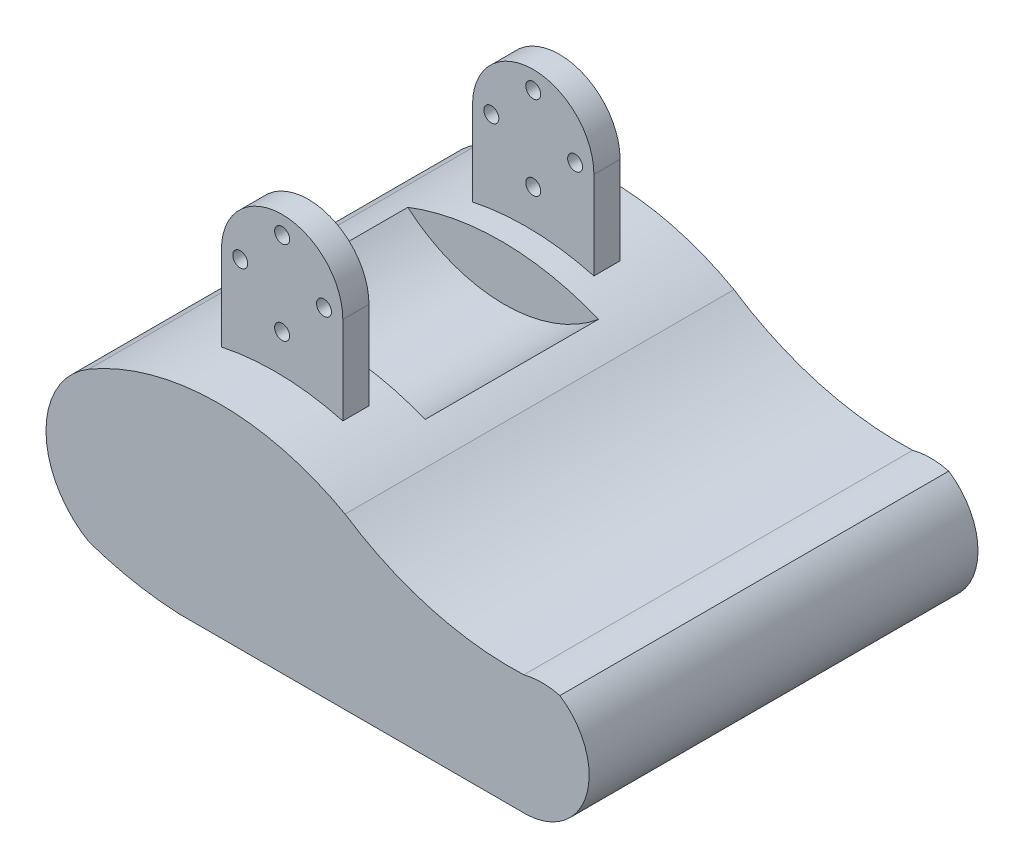
ISO-10303-21;
HEADER;
FILE_DESCRIPTION(('STEP AP214'),'2;1');
FILE_NAME('part.step','',(''),(''),'','','');
FILE_SCHEMA(('AUTOMOTIVE_DESIGN { 1 0 10303 214 1 1 1 1 }'));
ENDSEC;
DATA;
#1=APPLICATION_CONTEXT('core data for automotive mechanical design processes');
#2=APPLICATION_PROTOCOL_DEFINITION('international standard','automotive_design',2000,#1);
#3=PRODUCT_CONTEXT('',#1,'mechanical');
#4=PRODUCT('Part','Part','',(#3));
#5=PRODUCT_RELATED_PRODUCT_CATEGORY('part','',(#4));
#6=PRODUCT_DEFINITION_FORMATION('','',#4);
#7=PRODUCT_DEFINITION_CONTEXT('part definition',#1,'design');
#8=PRODUCT_DEFINITION('design','',#6,#7);
#9=PRODUCT_DEFINITION_SHAPE('','',#8);
#10=(LENGTH_UNIT() NAMED_UNIT(*) SI_UNIT(.MILLI.,.METRE.));
#11=(NAMED_UNIT(*) PLANE_ANGLE_UNIT() SI_UNIT($,.RADIAN.));
#12=(NAMED_UNIT(*) SI_UNIT($,.STERADIAN.) SOLID_ANGLE_UNIT());
#13=UNCERTAINTY_MEASURE_WITH_UNIT(LENGTH_MEASURE(1.E-05),#10,'distance_accuracy_value','');
#14=(GEOMETRIC_REPRESENTATION_CONTEXT(3) GLOBAL_UNCERTAINTY_ASSIGNED_CONTEXT((#13)) GLOBAL_UNIT_ASSIGNED_CONTEXT((#10,
#11,#12)) REPRESENTATION_CONTEXT('',''));
#15=CARTESIAN_POINT('',(0.,0.,0.));
#16=DIRECTION('',(0.,0.,1.));
#17=DIRECTION('',(1.,0.,0.));
#18=AXIS2_PLACEMENT_3D('',#15,#16,#17);
#19=CARTESIAN_POINT('',(-8.19760017163144,-12.2437197366426,40.));
#20=DIRECTION('',(0.,0.,-1.));
#21=DIRECTION('',(-1.,0.,0.));
#22=AXIS2_PLACEMENT_3D('',#19,#20,#21);
#23=CYLINDRICAL_SURFACE('',#22,43.1559879749917);
#24=CARTESIAN_POINT('',(-8.19760017163144,-12.2437197366426,43.175));
#25=DIRECTION('',(0.,0.,1.));
#26=DIRECTION('',(1.,0.,0.));
#27=AXIS2_PLACEMENT_3D('',#24,#25,#26);
#28=CIRCLE('',#27,43.1559879749917);
#29=CARTESIAN_POINT('',(-17.1668419191273,29.9699273525702,43.175));
#30=VERTEX_POINT('',#29);
#31=CARTESIAN_POINT('',(3.12038975833794,29.4017170126909,43.175));
#32=VERTEX_POINT('',#31);
#33=EDGE_CURVE('E379',#30,#32,#28,.F.);
#34=ORIENTED_EDGE('',*,*,#33,.F.);
#35=DIRECTION('',(0.,0.,-1.));
#36=VECTOR('',#35,1.);
#37=CARTESIAN_POINT('',(-17.1668419191273,29.9699273525702,40.));
#38=LINE('',#37,#36);
#39=CARTESIAN_POINT('',(-17.1668419191273,29.9699273525702,38.8));
#40=VERTEX_POINT('',#39);
#41=EDGE_CURVE('E357',#40,#30,#38,.F.);
#42=ORIENTED_EDGE('',*,*,#41,.F.);
#43=CARTESIAN_POINT('',(-8.19760017163144,-12.2437197366426,38.8));
#44=DIRECTION('',(0.,0.,1.));
#45=DIRECTION('',(1.,0.,0.));
#46=AXIS2_PLACEMENT_3D('',#43,#44,#45);
#47=CIRCLE('',#46,43.1559879749917);
#48=CARTESIAN_POINT('',(3.12038975833794,29.4017170126909,38.8));
#49=VERTEX_POINT('',#48);
#50=EDGE_CURVE('E377',#40,#49,#47,.F.);
#51=ORIENTED_EDGE('',*,*,#50,.T.);
#52=DIRECTION('',(0.,0.,-1.));
#53=VECTOR('',#52,1.);
#54=CARTESIAN_POINT('',(3.12038975833794,29.4017170126909,40.));
#55=LINE('',#54,#53);
#56=EDGE_CURVE('E360',#32,#49,#55,.T.);
#57=ORIENTED_EDGE('',*,*,#56,.F.);
#58=EDGE_LOOP('',(#34,#42,#51,#57));
#59=FACE_BOUND('',#58,.T.);
#60=CARTESIAN_POINT('',(-8.19760017163154,-12.2437197366544,5.4));
#61=DIRECTION('',(0.,0.,1.));
#62=DIRECTION('',(-1.,0.,0.));
#63=AXIS2_PLACEMENT_3D('',#60,#61,#62);
#64=CIRCLE('',#63,43.1559879750027);
#65=CARTESIAN_POINT('',(8.09755175302854,27.7176030874316,5.4));
#66=VERTEX_POINT('',#65);
#67=CARTESIAN_POINT('',(-23.7828023131124,27.9997986521216,5.4));
#68=VERTEX_POINT('',#67);
#69=EDGE_CURVE('E321',#66,#68,#64,.T.);
#70=ORIENTED_EDGE('',*,*,#69,.F.);
#71=DIRECTION('',(0.,0.,1.));
#72=VECTOR('',#71,1.);
#73=CARTESIAN_POINT('',(8.09755175302854,27.7176030874316,5.4));
#74=LINE('',#73,#72);
#75=CARTESIAN_POINT('',(8.09755175302854,27.7176030874316,34.4));
#76=VERTEX_POINT('',#75);
#77=EDGE_CURVE('E332',#66,#76,#74,.T.);
#78=ORIENTED_EDGE('',*,*,#77,.T.);
#79=CARTESIAN_POINT('',(-8.19760017163154,-12.2437197366544,34.4));
#80=DIRECTION('',(0.,0.,1.));
#81=DIRECTION('',(-1.,0.,0.));
#82=AXIS2_PLACEMENT_3D('',#79,#80,#81);
#83=CIRCLE('',#82,43.1559879750027);
#84=CARTESIAN_POINT('',(-23.7828023131124,27.9997986521216,34.4));
#85=VERTEX_POINT('',#84);
#86=EDGE_CURVE('E320',#76,#85,#83,.T.);
#87=ORIENTED_EDGE('',*,*,#86,.T.);
#88=DIRECTION('',(0.,0.,1.));
#89=VECTOR('',#88,1.);
#90=CARTESIAN_POINT('',(-23.7828023131124,27.9997986521216,5.4));
#91=LINE('',#90,#89);
#92=EDGE_CURVE('E327',#68,#85,#91,.T.);
#93=ORIENTED_EDGE('',*,*,#92,.F.);
#94=EDGE_LOOP('',(#70,#78,#87,#93));
#95=FACE_BOUND('',#94,.T.);
#96=DIRECTION('',(0.,0.,-1.));
#97=VECTOR('',#96,1.);
#98=CARTESIAN_POINT('',(-30.,25.,40.));
#99=LINE('',#98,#97);
#100=CARTESIAN_POINT('',(-30.,25.,52.5));
#101=VERTEX_POINT('',#100);
#102=CARTESIAN_POINT('',(-30.,25.,-12.5));
#103=VERTEX_POINT('',#102);
#104=EDGE_CURVE('E373',#101,#103,#99,.T.);
#105=ORIENTED_EDGE('',*,*,#104,.F.);
#106=CARTESIAN_POINT('',(-8.19760017163144,-12.2437197366426,52.5));
#107=DIRECTION('',(0.,0.,1.));
#108=DIRECTION('',(1.,0.,0.));
#109=AXIS2_PLACEMENT_3D('',#106,#107,#108);
#110=CIRCLE('',#109,43.1559879749917);
#111=CARTESIAN_POINT('',(12.833158080873,25.441111501169,52.5));
#112=VERTEX_POINT('',#111);
#113=EDGE_CURVE('E275',#112,#101,#110,.T.);
#114=ORIENTED_EDGE('',*,*,#113,.F.);
#115=DIRECTION('',(0.,0.,-1.));
#116=VECTOR('',#115,1.);
#117=CARTESIAN_POINT('',(12.833158080873,25.441111501169,40.));
#118=LINE('',#117,#116);
#119=CARTESIAN_POINT('',(12.833158080873,25.441111501169,-12.5));
#120=VERTEX_POINT('',#119);
#121=EDGE_CURVE('E375',#112,#120,#118,.T.);
#122=ORIENTED_EDGE('',*,*,#121,.T.);
#123=CARTESIAN_POINT('',(-8.19760017163144,-12.2437197366426,-12.5));
#124=DIRECTION('',(0.,0.,1.));
#125=DIRECTION('',(1.,0.,0.));
#126=AXIS2_PLACEMENT_3D('',#123,#124,#125);
#127=CIRCLE('',#126,43.1559879749917);
#128=EDGE_CURVE('E248',#120,#103,#127,.T.);
#129=ORIENTED_EDGE('',*,*,#128,.T.);
#130=EDGE_LOOP('',(#105,#114,#122,#129));
#131=FACE_BOUND('',#130,.T.);
#132=DIRECTION('',(0.,0.,-1.));
#133=VECTOR('',#132,1.);
#134=CARTESIAN_POINT('',(3.12038975833794,29.4017170126909,40.));
#135=LINE('',#134,#133);
#136=CARTESIAN_POINT('',(3.12038975833794,29.4017170126909,-3.175));
#137=VERTEX_POINT('',#136);
#138=CARTESIAN_POINT('',(3.12038975833794,29.4017170126909,1.2));
#139=VERTEX_POINT('',#138);
#140=EDGE_CURVE('E63',#137,#139,#135,.F.);
#141=ORIENTED_EDGE('',*,*,#140,.T.);
#142=CARTESIAN_POINT('',(-8.19760017163144,-12.2437197366426,1.2));
#143=DIRECTION('',(0.,0.,-1.));
#144=DIRECTION('',(-1.,0.,0.));
#145=AXIS2_PLACEMENT_3D('',#142,#143,#144);
#146=CIRCLE('',#145,43.1559879749917);
#147=CARTESIAN_POINT('',(-17.1668419191273,29.9699273525702,1.2));
#148=VERTEX_POINT('',#147);
#149=EDGE_CURVE('E11',#139,#148,#146,.F.);
#150=ORIENTED_EDGE('',*,*,#149,.T.);
#151=DIRECTION('',(0.,0.,-1.));
#152=VECTOR('',#151,1.);
#153=CARTESIAN_POINT('',(-17.1668419191273,29.9699273525702,40.));
#154=LINE('',#153,#152);
#155=CARTESIAN_POINT('',(-17.1668419191273,29.9699273525702,-3.175));
#156=VERTEX_POINT('',#155);
#157=EDGE_CURVE('E53',#148,#156,#154,.T.);
#158=ORIENTED_EDGE('',*,*,#157,.T.);
#159=CARTESIAN_POINT('',(-8.19760017163144,-12.2437197366426,-3.175));
#160=DIRECTION('',(0.,0.,-1.));
#161=DIRECTION('',(-1.,0.,0.));
#162=AXIS2_PLACEMENT_3D('',#159,#160,#161);
#163=CIRCLE('',#162,43.1559879749917);
#164=EDGE_CURVE('E382',#137,#156,#163,.F.);
#165=ORIENTED_EDGE('',*,*,#164,.F.);
#166=EDGE_LOOP('',(#141,#150,#158,#165));
#167=FACE_BOUND('',#166,.T.);
#168=ADVANCED_FACE('F45',(#59,#95,#131,#167),#23,.T.);
#169=CARTESIAN_POINT('',(3.12038975833794,44.0921251761886,38.8));
#170=DIRECTION('',(1.,0.,0.));
#171=DIRECTION('',(0.,1.,0.));
#172=AXIS2_PLACEMENT_3D('',#169,#170,#171);
#173=PLANE('',#172);
#174=DIRECTION('',(0.,1.,0.));
#175=VECTOR('',#174,1.);
#176=CARTESIAN_POINT('',(3.12038975833794,44.0921251761886,43.175));
#177=LINE('',#176,#175);
#178=CARTESIAN_POINT('',(3.12038975833794,44.0921251761886,43.175));
#179=VERTEX_POINT('',#178);
#180=EDGE_CURVE('E343',#32,#179,#177,.T.);
#181=ORIENTED_EDGE('',*,*,#180,.F.);
#182=ORIENTED_EDGE('',*,*,#56,.T.);
#183=DIRECTION('',(0.,1.,0.));
#184=VECTOR('',#183,1.);
#185=CARTESIAN_POINT('',(3.12038975833794,44.0921251761886,38.8));
#186=LINE('',#185,#184);
#187=CARTESIAN_POINT('',(3.12038975833794,44.0921251761886,38.8));
#188=VERTEX_POINT('',#187);
#189=EDGE_CURVE('E351',#49,#188,#186,.T.);
#190=ORIENTED_EDGE('',*,*,#189,.T.);
#191=DIRECTION('',(0.,0.,1.));
#192=VECTOR('',#191,1.);
#193=CARTESIAN_POINT('',(3.12038975833794,44.0921251761886,38.8));
#194=LINE('',#193,#192);
#195=EDGE_CURVE('E354',#188,#179,#194,.T.);
#196=ORIENTED_EDGE('',*,*,#195,.T.);
#197=EDGE_LOOP('',(#181,#182,#190,#196));
#198=FACE_BOUND('',#197,.T.);
#199=ADVANCED_FACE('F403',(#198),#173,.T.);
#200=CARTESIAN_POINT('',(-17.1668419191273,44.0921251761886,38.8));
#201=DIRECTION('',(-1.,0.,0.));
#202=DIRECTION('',(0.,-1.,0.));
#203=AXIS2_PLACEMENT_3D('',#200,#201,#202);
#204=PLANE('',#203);
#205=ORIENTED_EDGE('',*,*,#41,.T.);
#206=DIRECTION('',(0.,-1.,0.));
#207=VECTOR('',#206,1.);
#208=CARTESIAN_POINT('',(-17.1668419191273,44.0921251761886,43.175));
#209=LINE('',#208,#207);
#210=CARTESIAN_POINT('',(-17.1668419191273,44.0921251761886,43.175));
#211=VERTEX_POINT('',#210);
#212=EDGE_CURVE('E340',#211,#30,#209,.T.);
#213=ORIENTED_EDGE('',*,*,#212,.F.);
#214=DIRECTION('',(0.,0.,1.));
#215=VECTOR('',#214,1.);
#216=CARTESIAN_POINT('',(-17.1668419191273,44.0921251761886,38.8));
#217=LINE('',#216,#215);
#218=CARTESIAN_POINT('',(-17.1668419191273,44.0921251761886,38.8));
#219=VERTEX_POINT('',#218);
#220=EDGE_CURVE('E353',#219,#211,#217,.T.);
#221=ORIENTED_EDGE('',*,*,#220,.F.);
#222=DIRECTION('',(0.,-1.,0.));
#223=VECTOR('',#222,1.);
#224=CARTESIAN_POINT('',(-17.1668419191273,44.0921251761886,38.8));
#225=LINE('',#224,#223);
#226=EDGE_CURVE('E348',#219,#40,#225,.T.);
#227=ORIENTED_EDGE('',*,*,#226,.T.);
#228=EDGE_LOOP('',(#205,#213,#221,#227));
#229=FACE_BOUND('',#228,.T.);
#230=ADVANCED_FACE('F410',(#229),#204,.T.);
#231=CARTESIAN_POINT('',(40.6285609928474,67.4056096459166,40.));
#232=DIRECTION('',(0.,0.,-1.));
#233=DIRECTION('',(-1.,0.,0.));
#234=AXIS2_PLACEMENT_3D('',#231,#232,#233);
#235=CYLINDRICAL_SURFACE('',#234,50.3349136045698);
#236=DIRECTION('',(0.,0.,-1.));
#237=VECTOR('',#236,1.);
#238=CARTESIAN_POINT('',(42.708069615881,17.1136702175527,40.));
#239=LINE('',#238,#237);
#240=CARTESIAN_POINT('',(42.708069615881,17.1136702175526,52.5));
#241=VERTEX_POINT('',#240);
#242=CARTESIAN_POINT('',(42.708069615881,17.1136702175526,-12.5));
#243=VERTEX_POINT('',#242);
#244=EDGE_CURVE('E363',#241,#243,#239,.T.);
#245=ORIENTED_EDGE('',*,*,#244,.T.);
#246=CARTESIAN_POINT('',(40.6285609928474,67.4056096459166,-12.5));
#247=DIRECTION('',(0.,0.,1.));
#248=DIRECTION('',(1.,0.,0.));
#249=AXIS2_PLACEMENT_3D('',#246,#247,#248);
#250=CIRCLE('',#249,50.3349136045698);
#251=EDGE_CURVE('E257',#243,#120,#250,.F.);
#252=ORIENTED_EDGE('',*,*,#251,.T.);
#253=ORIENTED_EDGE('',*,*,#121,.F.);
#254=CARTESIAN_POINT('',(40.6285609928474,67.4056096459166,52.5));
#255=DIRECTION('',(0.,0.,1.));
#256=DIRECTION('',(1.,0.,0.));
#257=AXIS2_PLACEMENT_3D('',#254,#255,#256);
#258=CIRCLE('',#257,50.3349136045698);
#259=EDGE_CURVE('E293',#241,#112,#258,.F.);
#260=ORIENTED_EDGE('',*,*,#259,.F.);
#261=EDGE_LOOP('',(#245,#252,#253,#260));
#262=FACE_BOUND('',#261,.T.);
#263=ADVANCED_FACE('F47',(#262),#235,.F.);
#264=CARTESIAN_POINT('',(-22.6825247375472,12.5,40.));
#265=DIRECTION('',(0.,0.,-1.));
#266=DIRECTION('',(-1.,0.,0.));
#267=AXIS2_PLACEMENT_3D('',#264,#265,#266);
#268=CYLINDRICAL_SURFACE('',#267,14.4843171815798);
#269=ORIENTED_EDGE('',*,*,#104,.T.);
#270=CARTESIAN_POINT('',(-22.6825247375472,12.5,-12.5));
#271=DIRECTION('',(0.,0.,1.));
#272=DIRECTION('',(1.,0.,0.));
#273=AXIS2_PLACEMENT_3D('',#270,#271,#272);
#274=CIRCLE('',#273,14.4843171815798);
#275=CARTESIAN_POINT('',(-30.,0.,-12.5));
#276=VERTEX_POINT('',#275);
#277=EDGE_CURVE('E272',#103,#276,#274,.T.);
#278=ORIENTED_EDGE('',*,*,#277,.T.);
#279=DIRECTION('',(0.,0.,-1.));
#280=VECTOR('',#279,1.);
#281=CARTESIAN_POINT('',(-30.,0.,40.));
#282=LINE('',#281,#280);
#283=CARTESIAN_POINT('',(-30.,0.,52.5));
#284=VERTEX_POINT('',#283);
#285=EDGE_CURVE('E371',#284,#276,#282,.T.);
#286=ORIENTED_EDGE('',*,*,#285,.F.);
#287=CARTESIAN_POINT('',(-22.6825247375472,12.5,52.5));
#288=DIRECTION('',(0.,0.,1.));
#289=DIRECTION('',(1.,0.,0.));
#290=AXIS2_PLACEMENT_3D('',#287,#288,#289);
#291=CIRCLE('',#290,14.4843171815798);
#292=EDGE_CURVE('E278',#101,#284,#291,.T.);
#293=ORIENTED_EDGE('',*,*,#292,.F.);
#294=EDGE_LOOP('',(#269,#278,#286,#293));
#295=FACE_BOUND('',#294,.T.);
#296=ADVANCED_FACE('F416',(#295),#268,.T.);
#297=CARTESIAN_POINT('',(-12.2066730687182,52.0503426449492,40.));
#298=DIRECTION('',(0.,0.,-1.));
#299=DIRECTION('',(-1.,0.,0.));
#300=AXIS2_PLACEMENT_3D('',#297,#298,#299);
#301=CYLINDRICAL_SURFACE('',#300,55.0076417667591);
#302=ORIENTED_EDGE('',*,*,#285,.T.);
#303=CARTESIAN_POINT('',(-12.2066730687182,52.0503426449492,-12.5));
#304=DIRECTION('',(0.,0.,1.));
#305=DIRECTION('',(1.,0.,0.));
#306=AXIS2_PLACEMENT_3D('',#303,#304,#305);
#307=CIRCLE('',#306,55.0076417667591);
#308=CARTESIAN_POINT('',(-15.,-2.88632978244734,-12.5));
#309=VERTEX_POINT('',#308);
#310=EDGE_CURVE('E269',#276,#309,#307,.T.);
#311=ORIENTED_EDGE('',*,*,#310,.T.);
#312=DIRECTION('',(0.,0.,-1.));
#313=VECTOR('',#312,1.);
#314=CARTESIAN_POINT('',(-15.,-2.88632978244734,40.));
#315=LINE('',#314,#313);
#316=CARTESIAN_POINT('',(-15.,-2.88632978244734,52.5));
#317=VERTEX_POINT('',#316);
#318=EDGE_CURVE('E369',#317,#309,#315,.T.);
#319=ORIENTED_EDGE('',*,*,#318,.F.);
#320=CARTESIAN_POINT('',(-12.2066730687182,52.0503426449492,52.5));
#321=DIRECTION('',(0.,0.,1.));
#322=DIRECTION('',(1.,0.,0.));
#323=AXIS2_PLACEMENT_3D('',#320,#321,#322);
#324=CIRCLE('',#323,55.0076417667591);
#325=EDGE_CURVE('E281',#284,#317,#324,.T.);
#326=ORIENTED_EDGE('',*,*,#325,.F.);
#327=EDGE_LOOP('',(#302,#311,#319,#326));
#328=FACE_BOUND('',#327,.T.);
#329=ADVANCED_FACE('F419',(#328),#301,.T.);
#330=CARTESIAN_POINT('',(0.,-2.88632978244734,40.));
#331=DIRECTION('',(0.,1.,0.));
#332=DIRECTION('',(0.,0.,1.));
#333=AXIS2_PLACEMENT_3D('',#330,#331,#332);
#334=PLANE('',#333);
#335=DIRECTION('',(1.,0.,0.));
#336=VECTOR('',#335,1.);
#337=CARTESIAN_POINT('',(-12.,-2.88632978244734,-9.5));
#338=LINE('',#337,#336);
#339=CARTESIAN_POINT('',(-12.,-2.88632978244734,-9.5));
#340=VERTEX_POINT('',#339);
#341=CARTESIAN_POINT('',(39.025429481435,-2.88632978244734,-9.5));
#342=VERTEX_POINT('',#341);
#343=EDGE_CURVE('E238',#340,#342,#338,.T.);
#344=ORIENTED_EDGE('',*,*,#343,.F.);
#345=DIRECTION('',(0.,0.,-1.));
#346=VECTOR('',#345,1.);
#347=CARTESIAN_POINT('',(-12.,-2.88632978244734,49.5));
#348=LINE('',#347,#346);
#349=CARTESIAN_POINT('',(-12.,-2.88632978244734,49.5));
#350=VERTEX_POINT('',#349);
#351=EDGE_CURVE('E221',#350,#340,#348,.T.);
#352=ORIENTED_EDGE('',*,*,#351,.F.);
#353=DIRECTION('',(-1.,0.,0.));
#354=VECTOR('',#353,1.);
#355=CARTESIAN_POINT('',(39.025429481435,-2.88632978244734,49.5));
#356=LINE('',#355,#354);
#357=CARTESIAN_POINT('',(39.025429481435,-2.88632978244734,49.5));
#358=VERTEX_POINT('',#357);
#359=EDGE_CURVE('E227',#358,#350,#356,.T.);
#360=ORIENTED_EDGE('',*,*,#359,.F.);
#361=DIRECTION('',(0.,0.,1.));
#362=VECTOR('',#361,1.);
#363=CARTESIAN_POINT('',(39.025429481435,-2.88632978244734,-9.5));
#364=LINE('',#363,#362);
#365=EDGE_CURVE('E241',#342,#358,#364,.T.);
#366=ORIENTED_EDGE('',*,*,#365,.F.);
#367=EDGE_LOOP('',(#344,#352,#360,#366));
#368=FACE_BOUND('',#367,.T.);
#369=ORIENTED_EDGE('',*,*,#318,.T.);
#370=DIRECTION('',(1.,0.,0.));
#371=VECTOR('',#370,1.);
#372=CARTESIAN_POINT('',(0.,-2.88632978244734,-12.5));
#373=LINE('',#372,#371);
#374=CARTESIAN_POINT('',(42.025429481435,-2.88632978244734,-12.5));
#375=VERTEX_POINT('',#374);
#376=EDGE_CURVE('E266',#309,#375,#373,.T.);
#377=ORIENTED_EDGE('',*,*,#376,.T.);
#378=DIRECTION('',(0.,0.,-1.));
#379=VECTOR('',#378,1.);
#380=CARTESIAN_POINT('',(42.025429481435,-2.88632978244734,40.));
#381=LINE('',#380,#379);
#382=CARTESIAN_POINT('',(42.025429481435,-2.88632978244734,52.5));
#383=VERTEX_POINT('',#382);
#384=EDGE_CURVE('E367',#383,#375,#381,.T.);
#385=ORIENTED_EDGE('',*,*,#384,.F.);
#386=DIRECTION('',(1.,0.,0.));
#387=VECTOR('',#386,1.);
#388=CARTESIAN_POINT('',(0.,-2.88632978244734,52.5));
#389=LINE('',#388,#387);
#390=EDGE_CURVE('E284',#317,#383,#389,.T.);
#391=ORIENTED_EDGE('',*,*,#390,.F.);
#392=EDGE_LOOP('',(#369,#377,#385,#391));
#393=FACE_BOUND('',#392,.T.);
#394=ADVANCED_FACE('F423',(#368,#393),#334,.F.);
#395=CARTESIAN_POINT('',(42.7080696158892,8.00980736960607,40.));
#396=DIRECTION('',(0.,0.,-1.));
#397=DIRECTION('',(-1.,0.,0.));
#398=AXIS2_PLACEMENT_3D('',#395,#396,#397);
#399=CYLINDRICAL_SURFACE('',#398,10.9174998231979);
#400=ORIENTED_EDGE('',*,*,#384,.T.);
#401=CARTESIAN_POINT('',(42.7080696158892,8.00980736960607,-12.5));
#402=DIRECTION('',(0.,0.,1.));
#403=DIRECTION('',(1.,0.,0.));
#404=AXIS2_PLACEMENT_3D('',#401,#402,#403);
#405=CIRCLE('',#404,10.9174998231979);
#406=CARTESIAN_POINT('',(48.7339706800707,17.1136702175527,-12.5));
#407=VERTEX_POINT('',#406);
#408=EDGE_CURVE('E263',#375,#407,#405,.T.);
#409=ORIENTED_EDGE('',*,*,#408,.T.);
#410=DIRECTION('',(0.,0.,-1.));
#411=VECTOR('',#410,1.);
#412=CARTESIAN_POINT('',(48.7339706800707,17.1136702175527,40.));
#413=LINE('',#412,#411);
#414=CARTESIAN_POINT('',(48.7339706800707,17.1136702175527,52.5));
#415=VERTEX_POINT('',#414);
#416=EDGE_CURVE('E365',#415,#407,#413,.T.);
#417=ORIENTED_EDGE('',*,*,#416,.F.);
#418=CARTESIAN_POINT('',(42.7080696158892,8.00980736960607,52.5));
#419=DIRECTION('',(0.,0.,1.));
#420=DIRECTION('',(1.,0.,0.));
#421=AXIS2_PLACEMENT_3D('',#418,#419,#420);
#422=CIRCLE('',#421,10.9174998231979);
#423=EDGE_CURVE('E287',#383,#415,#422,.T.);
#424=ORIENTED_EDGE('',*,*,#423,.F.);
#425=EDGE_LOOP('',(#400,#409,#417,#424));
#426=FACE_BOUND('',#425,.T.);
#427=ADVANCED_FACE('F427',(#426),#399,.T.);
#428=CARTESIAN_POINT('',(45.7210201479759,5.46479243697213,40.));
#429=DIRECTION('',(0.,0.,-1.));
#430=DIRECTION('',(-1.,0.,0.));
#431=AXIS2_PLACEMENT_3D('',#428,#429,#430);
#432=CYLINDRICAL_SURFACE('',#431,12.032216107424);
#433=ORIENTED_EDGE('',*,*,#416,.T.);
#434=CARTESIAN_POINT('',(45.7210201479759,5.46479243697213,-12.5));
#435=DIRECTION('',(0.,0.,1.));
#436=DIRECTION('',(1.,0.,0.));
#437=AXIS2_PLACEMENT_3D('',#434,#435,#436);
#438=CIRCLE('',#437,12.032216107424);
#439=EDGE_CURVE('E260',#407,#243,#438,.T.);
#440=ORIENTED_EDGE('',*,*,#439,.T.);
#441=ORIENTED_EDGE('',*,*,#244,.F.);
#442=CARTESIAN_POINT('',(45.7210201479759,5.46479243697213,52.5));
#443=DIRECTION('',(0.,0.,1.));
#444=DIRECTION('',(1.,0.,0.));
#445=AXIS2_PLACEMENT_3D('',#442,#443,#444);
#446=CIRCLE('',#445,12.032216107424);
#447=EDGE_CURVE('E290',#415,#241,#446,.T.);
#448=ORIENTED_EDGE('',*,*,#447,.F.);
#449=EDGE_LOOP('',(#433,#440,#441,#448));
#450=FACE_BOUND('',#449,.T.);
#451=ADVANCED_FACE('F431',(#450),#432,.T.);
#452=CARTESIAN_POINT('',(-7.02322608039468,44.0921251761886,38.8));
#453=DIRECTION('',(0.,0.,1.));
#454=DIRECTION('',(1.,0.,0.));
#455=AXIS2_PLACEMENT_3D('',#452,#453,#454);
#456=CYLINDRICAL_SURFACE('',#455,10.1436158387326);
#457=ORIENTED_EDGE('',*,*,#220,.T.);
#458=CARTESIAN_POINT('',(-7.02322608039468,44.0921251761886,43.175));
#459=DIRECTION('',(0.,0.,1.));
#460=DIRECTION('',(1.,0.,0.));
#461=AXIS2_PLACEMENT_3D('',#458,#459,#460);
#462=CIRCLE('',#461,10.1436158387326);
#463=EDGE_CURVE('E335',#179,#211,#462,.T.);
#464=ORIENTED_EDGE('',*,*,#463,.F.);
#465=ORIENTED_EDGE('',*,*,#195,.F.);
#466=CARTESIAN_POINT('',(-7.02322608039468,44.0921251761886,38.8));
#467=DIRECTION('',(0.,0.,1.));
#468=DIRECTION('',(1.,0.,0.));
#469=AXIS2_PLACEMENT_3D('',#466,#467,#468);
#470=CIRCLE('',#469,10.1436158387326);
#471=EDGE_CURVE('E345',#188,#219,#470,.T.);
#472=ORIENTED_EDGE('',*,*,#471,.T.);
#473=EDGE_LOOP('',(#457,#464,#465,#472));
#474=FACE_BOUND('',#473,.T.);
#475=ADVANCED_FACE('F435',(#474),#456,.T.);
#476=CARTESIAN_POINT('',(-7.02322608039468,44.0921251761886,38.8));
#477=DIRECTION('',(0.,0.,1.));
#478=DIRECTION('',(1.,0.,0.));
#479=AXIS2_PLACEMENT_3D('',#476,#477,#478);
#480=PLANE('',#479);
#481=CARTESIAN_POINT('',(-7.02322608039468,51.2357410149212,38.8));
#482=DIRECTION('',(0.,0.,1.));
#483=DIRECTION('',(1.,0.,0.));
#484=AXIS2_PLACEMENT_3D('',#481,#482,#483);
#485=CIRCLE('',#484,1.25);
#486=CARTESIAN_POINT('',(-5.77322608039468,51.2357410149212,38.8));
#487=VERTEX_POINT('',#486);
#488=EDGE_CURVE('E317',#487,#487,#485,.T.);
#489=ORIENTED_EDGE('',*,*,#488,.T.);
#490=EDGE_LOOP('',(#489));
#491=FACE_BOUND('',#490,.T.);
#492=CARTESIAN_POINT('',(-0.0232260803946782,44.2357410149212,38.8));
#493=DIRECTION('',(0.,0.,1.));
#494=DIRECTION('',(1.,0.,0.));
#495=AXIS2_PLACEMENT_3D('',#492,#493,#494);
#496=CIRCLE('',#495,1.25);
#497=CARTESIAN_POINT('',(1.22677391960532,44.2357410149212,38.8));
#498=VERTEX_POINT('',#497);
#499=EDGE_CURVE('E314',#498,#498,#496,.T.);
#500=ORIENTED_EDGE('',*,*,#499,.T.);
#501=EDGE_LOOP('',(#500));
#502=FACE_BOUND('',#501,.T.);
#503=CARTESIAN_POINT('',(-7.02322608039468,37.2357410149212,38.8));
#504=DIRECTION('',(0.,0.,1.));
#505=DIRECTION('',(1.,0.,0.));
#506=AXIS2_PLACEMENT_3D('',#503,#504,#505);
#507=CIRCLE('',#506,1.25);
#508=CARTESIAN_POINT('',(-5.77322608039468,37.2357410149212,38.8));
#509=VERTEX_POINT('',#508);
#510=EDGE_CURVE('E311',#509,#509,#507,.T.);
#511=ORIENTED_EDGE('',*,*,#510,.T.);
#512=EDGE_LOOP('',(#511));
#513=FACE_BOUND('',#512,.T.);
#514=CARTESIAN_POINT('',(-14.0232260803947,44.2357410149212,38.8));
#515=DIRECTION('',(0.,0.,1.));
#516=DIRECTION('',(1.,0.,0.));
#517=AXIS2_PLACEMENT_3D('',#514,#515,#516);
#518=CIRCLE('',#517,1.25);
#519=CARTESIAN_POINT('',(-12.7732260803947,44.2357410149212,38.8));
#520=VERTEX_POINT('',#519);
#521=EDGE_CURVE('E300',#520,#520,#518,.T.);
#522=ORIENTED_EDGE('',*,*,#521,.T.);
#523=EDGE_LOOP('',(#522));
#524=FACE_BOUND('',#523,.T.);
#525=ORIENTED_EDGE('',*,*,#50,.F.);
#526=ORIENTED_EDGE('',*,*,#226,.F.);
#527=ORIENTED_EDGE('',*,*,#471,.F.);
#528=ORIENTED_EDGE('',*,*,#189,.F.);
#529=EDGE_LOOP('',(#525,#526,#527,#528));
#530=FACE_BOUND('',#529,.T.);
#531=ADVANCED_FACE('F439',(#491,#502,#513,#524,#530),#480,.F.);
#532=CARTESIAN_POINT('',(-7.02322608039468,44.0921251761886,43.175));
#533=DIRECTION('',(0.,0.,1.));
#534=DIRECTION('',(1.,0.,0.));
#535=AXIS2_PLACEMENT_3D('',#532,#533,#534);
#536=PLANE('',#535);
#537=CARTESIAN_POINT('',(-7.02322608039468,51.2357410149212,43.175));
#538=DIRECTION('',(0.,0.,1.));
#539=DIRECTION('',(1.,0.,0.));
#540=AXIS2_PLACEMENT_3D('',#537,#538,#539);
#541=CIRCLE('',#540,1.25);
#542=CARTESIAN_POINT('',(-5.77322608039468,51.2357410149212,43.175));
#543=VERTEX_POINT('',#542);
#544=EDGE_CURVE('E297',#543,#543,#541,.T.);
#545=ORIENTED_EDGE('',*,*,#544,.F.);
#546=EDGE_LOOP('',(#545));
#547=FACE_BOUND('',#546,.T.);
#548=CARTESIAN_POINT('',(-0.0232260803946782,44.2357410149212,43.175));
#549=DIRECTION('',(0.,0.,1.));
#550=DIRECTION('',(1.,0.,0.));
#551=AXIS2_PLACEMENT_3D('',#548,#549,#550);
#552=CIRCLE('',#551,1.25);
#553=CARTESIAN_POINT('',(1.22677391960532,44.2357410149212,43.175));
#554=VERTEX_POINT('',#553);
#555=EDGE_CURVE('E301',#554,#554,#552,.T.);
#556=ORIENTED_EDGE('',*,*,#555,.F.);
#557=EDGE_LOOP('',(#556));
#558=FACE_BOUND('',#557,.T.);
#559=CARTESIAN_POINT('',(-7.02322608039468,37.2357410149212,43.175));
#560=DIRECTION('',(0.,0.,1.));
#561=DIRECTION('',(1.,0.,0.));
#562=AXIS2_PLACEMENT_3D('',#559,#560,#561);
#563=CIRCLE('',#562,1.25);
#564=CARTESIAN_POINT('',(-5.77322608039468,37.2357410149212,43.175));
#565=VERTEX_POINT('',#564);
#566=EDGE_CURVE('E304',#565,#565,#563,.T.);
#567=ORIENTED_EDGE('',*,*,#566,.F.);
#568=EDGE_LOOP('',(#567));
#569=FACE_BOUND('',#568,.T.);
#570=CARTESIAN_POINT('',(-14.0232260803947,44.2357410149212,43.175));
#571=DIRECTION('',(0.,0.,1.));
#572=DIRECTION('',(1.,0.,0.));
#573=AXIS2_PLACEMENT_3D('',#570,#571,#572);
#574=CIRCLE('',#573,1.25);
#575=CARTESIAN_POINT('',(-12.7732260803947,44.2357410149212,43.175));
#576=VERTEX_POINT('',#575);
#577=EDGE_CURVE('E296',#576,#576,#574,.T.);
#578=ORIENTED_EDGE('',*,*,#577,.F.);
#579=EDGE_LOOP('',(#578));
#580=FACE_BOUND('',#579,.T.);
#581=ORIENTED_EDGE('',*,*,#212,.T.);
#582=ORIENTED_EDGE('',*,*,#33,.T.);
#583=ORIENTED_EDGE('',*,*,#180,.T.);
#584=ORIENTED_EDGE('',*,*,#463,.T.);
#585=EDGE_LOOP('',(#581,#582,#583,#584));
#586=FACE_BOUND('',#585,.T.);
#587=ADVANCED_FACE('F446',(#547,#558,#569,#580,#586),#536,.T.);
#588=CARTESIAN_POINT('',(-7.6768083390229,46.5914644256421,5.4));
#589=DIRECTION('',(0.,0.,1.));
#590=DIRECTION('',(1.,0.,0.));
#591=AXIS2_PLACEMENT_3D('',#588,#589,#590);
#592=CYLINDRICAL_SURFACE('',#591,24.5978266952123);
#593=CARTESIAN_POINT('',(-7.6768083390229,46.5914644256421,34.4));
#594=DIRECTION('',(0.,0.,1.));
#595=DIRECTION('',(1.,0.,0.));
#596=AXIS2_PLACEMENT_3D('',#593,#594,#595);
#597=CIRCLE('',#596,24.5978266952123);
#598=EDGE_CURVE('E324',#85,#76,#597,.T.);
#599=ORIENTED_EDGE('',*,*,#598,.T.);
#600=ORIENTED_EDGE('',*,*,#77,.F.);
#601=CARTESIAN_POINT('',(-7.6768083390229,46.5914644256421,5.4));
#602=DIRECTION('',(0.,0.,1.));
#603=DIRECTION('',(1.,0.,0.));
#604=AXIS2_PLACEMENT_3D('',#601,#602,#603);
#605=CIRCLE('',#604,24.5978266952123);
#606=EDGE_CURVE('E323',#68,#66,#605,.T.);
#607=ORIENTED_EDGE('',*,*,#606,.F.);
#608=ORIENTED_EDGE('',*,*,#92,.T.);
#609=EDGE_LOOP('',(#599,#600,#607,#608));
#610=FACE_BOUND('',#609,.T.);
#611=ADVANCED_FACE('F450',(#610),#592,.F.);
#612=CARTESIAN_POINT('',(-7.93720425532722,17.1738723444938,5.4));
#613=DIRECTION('',(0.,0.,-1.));
#614=DIRECTION('',(-1.,0.,0.));
#615=AXIS2_PLACEMENT_3D('',#612,#613,#614);
#616=PLANE('',#615);
#617=ORIENTED_EDGE('',*,*,#69,.T.);
#618=ORIENTED_EDGE('',*,*,#606,.T.);
#619=EDGE_LOOP('',(#617,#618));
#620=FACE_BOUND('',#619,.T.);
#621=ADVANCED_FACE('F454',(#620),#616,.F.);
#622=CARTESIAN_POINT('',(-7.93720425532722,17.1738723444938,34.4));
#623=DIRECTION('',(0.,0.,-1.));
#624=DIRECTION('',(-1.,0.,0.));
#625=AXIS2_PLACEMENT_3D('',#622,#623,#624);
#626=PLANE('',#625);
#627=ORIENTED_EDGE('',*,*,#86,.F.);
#628=ORIENTED_EDGE('',*,*,#598,.F.);
#629=EDGE_LOOP('',(#627,#628));
#630=FACE_BOUND('',#629,.T.);
#631=ADVANCED_FACE('F456',(#630),#626,.T.);
#632=CARTESIAN_POINT('',(-14.0232260803947,44.2357410149212,33.175));
#633=DIRECTION('',(0.,0.,1.));
#634=DIRECTION('',(1.,0.,0.));
#635=AXIS2_PLACEMENT_3D('',#632,#633,#634);
#636=CYLINDRICAL_SURFACE('',#635,1.25);
#637=ORIENTED_EDGE('',*,*,#577,.T.);
#638=EDGE_LOOP('',(#637));
#639=FACE_BOUND('',#638,.T.);
#640=ORIENTED_EDGE('',*,*,#521,.F.);
#641=EDGE_LOOP('',(#640));
#642=FACE_BOUND('',#641,.T.);
#643=ADVANCED_FACE('F459',(#639,#642),#636,.F.);
#644=CARTESIAN_POINT('',(-7.02322608039468,37.2357410149212,33.175));
#645=DIRECTION('',(0.,0.,1.));
#646=DIRECTION('',(1.,0.,0.));
#647=AXIS2_PLACEMENT_3D('',#644,#645,#646);
#648=CYLINDRICAL_SURFACE('',#647,1.25);
#649=ORIENTED_EDGE('',*,*,#566,.T.);
#650=EDGE_LOOP('',(#649));
#651=FACE_BOUND('',#650,.T.);
#652=ORIENTED_EDGE('',*,*,#510,.F.);
#653=EDGE_LOOP('',(#652));
#654=FACE_BOUND('',#653,.T.);
#655=ADVANCED_FACE('F466',(#651,#654),#648,.F.);
#656=CARTESIAN_POINT('',(-0.0232260803946782,44.2357410149212,33.175));
#657=DIRECTION('',(0.,0.,1.));
#658=DIRECTION('',(1.,0.,0.));
#659=AXIS2_PLACEMENT_3D('',#656,#657,#658);
#660=CYLINDRICAL_SURFACE('',#659,1.25);
#661=ORIENTED_EDGE('',*,*,#555,.T.);
#662=EDGE_LOOP('',(#661));
#663=FACE_BOUND('',#662,.T.);
#664=ORIENTED_EDGE('',*,*,#499,.F.);
#665=EDGE_LOOP('',(#664));
#666=FACE_BOUND('',#665,.T.);
#667=ADVANCED_FACE('F470',(#663,#666),#660,.F.);
#668=CARTESIAN_POINT('',(-7.02322608039468,51.2357410149212,33.175));
#669=DIRECTION('',(0.,0.,1.));
#670=DIRECTION('',(1.,0.,0.));
#671=AXIS2_PLACEMENT_3D('',#668,#669,#670);
#672=CYLINDRICAL_SURFACE('',#671,1.25);
#673=ORIENTED_EDGE('',*,*,#544,.T.);
#674=EDGE_LOOP('',(#673));
#675=FACE_BOUND('',#674,.T.);
#676=ORIENTED_EDGE('',*,*,#488,.F.);
#677=EDGE_LOOP('',(#676));
#678=FACE_BOUND('',#677,.T.);
#679=ADVANCED_FACE('F474',(#675,#678),#672,.F.);
#680=CARTESIAN_POINT('',(0.,0.,52.5));
#681=DIRECTION('',(0.,0.,1.));
#682=DIRECTION('',(1.,0.,0.));
#683=AXIS2_PLACEMENT_3D('',#680,#681,#682);
#684=PLANE('',#683);
#685=ORIENTED_EDGE('',*,*,#113,.T.);
#686=ORIENTED_EDGE('',*,*,#292,.T.);
#687=ORIENTED_EDGE('',*,*,#325,.T.);
#688=ORIENTED_EDGE('',*,*,#390,.T.);
#689=ORIENTED_EDGE('',*,*,#423,.T.);
#690=ORIENTED_EDGE('',*,*,#447,.T.);
#691=ORIENTED_EDGE('',*,*,#259,.T.);
#692=EDGE_LOOP('',(#685,#686,#687,#688,#689,#690,#691));
#693=FACE_BOUND('',#692,.T.);
#694=ADVANCED_FACE('F478',(#693),#684,.T.);
#695=CARTESIAN_POINT('',(0.,0.,-12.5));
#696=DIRECTION('',(0.,0.,-1.));
#697=DIRECTION('',(1.,0.,0.));
#698=AXIS2_PLACEMENT_3D('',#695,#696,#697);
#699=PLANE('',#698);
#700=ORIENTED_EDGE('',*,*,#128,.F.);
#701=ORIENTED_EDGE('',*,*,#251,.F.);
#702=ORIENTED_EDGE('',*,*,#439,.F.);
#703=ORIENTED_EDGE('',*,*,#408,.F.);
#704=ORIENTED_EDGE('',*,*,#376,.F.);
#705=ORIENTED_EDGE('',*,*,#310,.F.);
#706=ORIENTED_EDGE('',*,*,#277,.F.);
#707=EDGE_LOOP('',(#700,#701,#702,#703,#704,#705,#706));
#708=FACE_BOUND('',#707,.T.);
#709=ADVANCED_FACE('F482',(#708),#699,.T.);
#710=CARTESIAN_POINT('',(-12.,0.288670217552664,49.5));
#711=DIRECTION('',(-1.,0.,0.));
#712=DIRECTION('',(0.,0.,1.));
#713=AXIS2_PLACEMENT_3D('',#710,#711,#712);
#714=PLANE('',#713);
#715=ORIENTED_EDGE('',*,*,#351,.T.);
#716=DIRECTION('',(0.,-1.,0.));
#717=VECTOR('',#716,1.);
#718=CARTESIAN_POINT('',(-12.,0.288670217552664,-9.5));
#719=LINE('',#718,#717);
#720=CARTESIAN_POINT('',(-12.,0.288670217552664,-9.5));
#721=VERTEX_POINT('',#720);
#722=EDGE_CURVE('E236',#721,#340,#719,.T.);
#723=ORIENTED_EDGE('',*,*,#722,.F.);
#724=DIRECTION('',(0.,0.,-1.));
#725=VECTOR('',#724,1.);
#726=CARTESIAN_POINT('',(-12.,0.288670217552664,49.5));
#727=LINE('',#726,#725);
#728=CARTESIAN_POINT('',(-12.,0.288670217552664,49.5));
#729=VERTEX_POINT('',#728);
#730=EDGE_CURVE('E223',#729,#721,#727,.T.);
#731=ORIENTED_EDGE('',*,*,#730,.F.);
#732=DIRECTION('',(0.,-1.,0.));
#733=VECTOR('',#732,1.);
#734=CARTESIAN_POINT('',(-12.,0.288670217552664,49.5));
#735=LINE('',#734,#733);
#736=EDGE_CURVE('E246',#729,#350,#735,.T.);
#737=ORIENTED_EDGE('',*,*,#736,.T.);
#738=EDGE_LOOP('',(#715,#723,#731,#737));
#739=FACE_BOUND('',#738,.T.);
#740=ADVANCED_FACE('F486',(#739),#714,.F.);
#741=CARTESIAN_POINT('',(39.025429481435,0.288670217552664,49.5));
#742=DIRECTION('',(0.,0.,1.));
#743=DIRECTION('',(1.,0.,0.));
#744=AXIS2_PLACEMENT_3D('',#741,#742,#743);
#745=PLANE('',#744);
#746=ORIENTED_EDGE('',*,*,#359,.T.);
#747=ORIENTED_EDGE('',*,*,#736,.F.);
#748=DIRECTION('',(-1.,0.,0.));
#749=VECTOR('',#748,1.);
#750=CARTESIAN_POINT('',(39.025429481435,0.288670217552664,49.5));
#751=LINE('',#750,#749);
#752=CARTESIAN_POINT('',(39.025429481435,0.288670217552664,49.5));
#753=VERTEX_POINT('',#752);
#754=EDGE_CURVE('E233',#753,#729,#751,.T.);
#755=ORIENTED_EDGE('',*,*,#754,.F.);
#756=DIRECTION('',(0.,-1.,0.));
#757=VECTOR('',#756,1.);
#758=CARTESIAN_POINT('',(39.025429481435,0.288670217552664,49.5));
#759=LINE('',#758,#757);
#760=EDGE_CURVE('E249',#753,#358,#759,.T.);
#761=ORIENTED_EDGE('',*,*,#760,.T.);
#762=EDGE_LOOP('',(#746,#747,#755,#761));
#763=FACE_BOUND('',#762,.T.);
#764=ADVANCED_FACE('F490',(#763),#745,.F.);
#765=CARTESIAN_POINT('',(39.025429481435,0.288670217552664,-9.5));
#766=DIRECTION('',(1.,0.,0.));
#767=DIRECTION('',(0.,0.,-1.));
#768=AXIS2_PLACEMENT_3D('',#765,#766,#767);
#769=PLANE('',#768);
#770=ORIENTED_EDGE('',*,*,#365,.T.);
#771=ORIENTED_EDGE('',*,*,#760,.F.);
#772=DIRECTION('',(0.,0.,1.));
#773=VECTOR('',#772,1.);
#774=CARTESIAN_POINT('',(39.025429481435,0.288670217552664,-9.5));
#775=LINE('',#774,#773);
#776=CARTESIAN_POINT('',(39.025429481435,0.288670217552664,-9.5));
#777=VERTEX_POINT('',#776);
#778=EDGE_CURVE('E230',#777,#753,#775,.T.);
#779=ORIENTED_EDGE('',*,*,#778,.F.);
#780=DIRECTION('',(0.,-1.,0.));
#781=VECTOR('',#780,1.);
#782=CARTESIAN_POINT('',(39.025429481435,0.288670217552664,-9.5));
#783=LINE('',#782,#781);
#784=EDGE_CURVE('E251',#777,#342,#783,.T.);
#785=ORIENTED_EDGE('',*,*,#784,.T.);
#786=EDGE_LOOP('',(#770,#771,#779,#785));
#787=FACE_BOUND('',#786,.T.);
#788=ADVANCED_FACE('F496',(#787),#769,.F.);
#789=CARTESIAN_POINT('',(-12.,0.288670217552664,-9.5));
#790=DIRECTION('',(0.,0.,-1.));
#791=DIRECTION('',(-1.,0.,0.));
#792=AXIS2_PLACEMENT_3D('',#789,#790,#791);
#793=PLANE('',#792);
#794=ORIENTED_EDGE('',*,*,#343,.T.);
#795=ORIENTED_EDGE('',*,*,#784,.F.);
#796=DIRECTION('',(1.,0.,0.));
#797=VECTOR('',#796,1.);
#798=CARTESIAN_POINT('',(-12.,0.288670217552664,-9.5));
#799=LINE('',#798,#797);
#800=EDGE_CURVE('E226',#721,#777,#799,.T.);
#801=ORIENTED_EDGE('',*,*,#800,.F.);
#802=ORIENTED_EDGE('',*,*,#722,.T.);
#803=EDGE_LOOP('',(#794,#795,#801,#802));
#804=FACE_BOUND('',#803,.T.);
#805=ADVANCED_FACE('F492',(#804),#793,.F.);
#806=CARTESIAN_POINT('',(0.,0.288670217552664,0.));
#807=DIRECTION('',(0.,-1.,0.));
#808=DIRECTION('',(0.,0.,-1.));
#809=AXIS2_PLACEMENT_3D('',#806,#807,#808);
#810=PLANE('',#809);
#811=ORIENTED_EDGE('',*,*,#730,.T.);
#812=ORIENTED_EDGE('',*,*,#800,.T.);
#813=ORIENTED_EDGE('',*,*,#778,.T.);
#814=ORIENTED_EDGE('',*,*,#754,.T.);
#815=EDGE_LOOP('',(#811,#812,#813,#814));
#816=FACE_BOUND('',#815,.T.);
#817=ADVANCED_FACE('F495',(#816),#810,.T.);
#818=CARTESIAN_POINT('',(-7.02322608039468,44.0921251761886,1.2));
#819=DIRECTION('',(0.,0.,-1.));
#820=DIRECTION('',(-1.,0.,0.));
#821=AXIS2_PLACEMENT_3D('',#818,#819,#820);
#822=CYLINDRICAL_SURFACE('',#821,10.1436158387326);
#823=DIRECTION('',(0.,0.,-1.));
#824=VECTOR('',#823,1.);
#825=CARTESIAN_POINT('',(3.12038975833794,44.0921251761886,1.2));
#826=LINE('',#825,#824);
#827=CARTESIAN_POINT('',(3.12038975833794,44.0921251761886,1.2));
#828=VERTEX_POINT('',#827);
#829=CARTESIAN_POINT('',(3.12038975833794,44.0921251761886,-3.175));
#830=VERTEX_POINT('',#829);
#831=EDGE_CURVE('E188',#828,#830,#826,.T.);
#832=ORIENTED_EDGE('',*,*,#831,.T.);
#833=CARTESIAN_POINT('',(-7.02322608039468,44.0921251761886,-3.175));
#834=DIRECTION('',(0.,0.,1.));
#835=DIRECTION('',(1.,0.,0.));
#836=AXIS2_PLACEMENT_3D('',#833,#834,#835);
#837=CIRCLE('',#836,10.1436158387326);
#838=CARTESIAN_POINT('',(-17.1668419191273,44.0921251761886,-3.175));
#839=VERTEX_POINT('',#838);
#840=EDGE_CURVE('E194',#830,#839,#837,.T.);
#841=ORIENTED_EDGE('',*,*,#840,.T.);
#842=DIRECTION('',(0.,0.,-1.));
#843=VECTOR('',#842,1.);
#844=CARTESIAN_POINT('',(-17.1668419191273,44.0921251761886,1.2));
#845=LINE('',#844,#843);
#846=CARTESIAN_POINT('',(-17.1668419191273,44.0921251761886,1.2));
#847=VERTEX_POINT('',#846);
#848=EDGE_CURVE('E203',#847,#839,#845,.T.);
#849=ORIENTED_EDGE('',*,*,#848,.F.);
#850=CARTESIAN_POINT('',(-7.02322608039468,44.0921251761886,1.2));
#851=DIRECTION('',(0.,0.,1.));
#852=DIRECTION('',(1.,0.,0.));
#853=AXIS2_PLACEMENT_3D('',#850,#851,#852);
#854=CIRCLE('',#853,10.1436158387326);
#855=EDGE_CURVE('E202',#828,#847,#854,.T.);
#856=ORIENTED_EDGE('',*,*,#855,.F.);
#857=EDGE_LOOP('',(#832,#841,#849,#856));
#858=FACE_BOUND('',#857,.T.);
#859=ADVANCED_FACE('F198',(#858),#822,.T.);
#860=CARTESIAN_POINT('',(-17.1668419191273,44.0921251761886,1.2));
#861=DIRECTION('',(1.,0.,0.));
#862=DIRECTION('',(0.,1.,0.));
#863=AXIS2_PLACEMENT_3D('',#860,#861,#862);
#864=PLANE('',#863);
#865=ORIENTED_EDGE('',*,*,#157,.F.);
#866=DIRECTION('',(0.,-1.,0.));
#867=VECTOR('',#866,1.);
#868=CARTESIAN_POINT('',(-17.1668419191273,44.0921251761886,1.2));
#869=LINE('',#868,#867);
#870=EDGE_CURVE('E204',#847,#148,#869,.T.);
#871=ORIENTED_EDGE('',*,*,#870,.F.);
#872=ORIENTED_EDGE('',*,*,#848,.T.);
#873=DIRECTION('',(0.,-1.,0.));
#874=VECTOR('',#873,1.);
#875=CARTESIAN_POINT('',(-17.1668419191273,44.0921251761886,-3.175));
#876=LINE('',#875,#874);
#877=EDGE_CURVE('E193',#839,#156,#876,.T.);
#878=ORIENTED_EDGE('',*,*,#877,.T.);
#879=EDGE_LOOP('',(#865,#871,#872,#878));
#880=FACE_BOUND('',#879,.T.);
#881=ADVANCED_FACE('F385',(#880),#864,.F.);
#882=CARTESIAN_POINT('',(3.12038975833794,44.0921251761886,1.2));
#883=DIRECTION('',(-1.,0.,0.));
#884=DIRECTION('',(0.,-1.,0.));
#885=AXIS2_PLACEMENT_3D('',#882,#883,#884);
#886=PLANE('',#885);
#887=ORIENTED_EDGE('',*,*,#140,.F.);
#888=DIRECTION('',(0.,1.,0.));
#889=VECTOR('',#888,1.);
#890=CARTESIAN_POINT('',(3.12038975833794,44.0921251761886,-3.175));
#891=LINE('',#890,#889);
#892=EDGE_CURVE('E184',#137,#830,#891,.T.);
#893=ORIENTED_EDGE('',*,*,#892,.T.);
#894=ORIENTED_EDGE('',*,*,#831,.F.);
#895=DIRECTION('',(0.,1.,0.));
#896=VECTOR('',#895,1.);
#897=CARTESIAN_POINT('',(3.12038975833794,44.0921251761886,1.2));
#898=LINE('',#897,#896);
#899=EDGE_CURVE('E217',#139,#828,#898,.T.);
#900=ORIENTED_EDGE('',*,*,#899,.F.);
#901=EDGE_LOOP('',(#887,#893,#894,#900));
#902=FACE_BOUND('',#901,.T.);
#903=ADVANCED_FACE('F186',(#902),#886,.F.);
#904=CARTESIAN_POINT('',(-7.02322608039468,44.0921251761886,1.2));
#905=DIRECTION('',(0.,0.,-1.));
#906=DIRECTION('',(1.,0.,0.));
#907=AXIS2_PLACEMENT_3D('',#904,#905,#906);
#908=PLANE('',#907);
#909=CARTESIAN_POINT('',(-7.02322608039468,51.2357410149212,1.2));
#910=DIRECTION('',(0.,0.,-1.));
#911=DIRECTION('',(-1.,0.,0.));
#912=AXIS2_PLACEMENT_3D('',#909,#910,#911);
#913=CIRCLE('',#912,1.25);
#914=CARTESIAN_POINT('',(-8.27322608039468,51.2357410149212,1.2));
#915=VERTEX_POINT('',#914);
#916=EDGE_CURVE('E208',#915,#915,#913,.F.);
#917=ORIENTED_EDGE('',*,*,#916,.F.);
#918=EDGE_LOOP('',(#917));
#919=FACE_BOUND('',#918,.T.);
#920=CARTESIAN_POINT('',(-0.0232260803946782,44.2357410149212,1.2));
#921=DIRECTION('',(0.,0.,-1.));
#922=DIRECTION('',(-1.,0.,0.));
#923=AXIS2_PLACEMENT_3D('',#920,#921,#922);
#924=CIRCLE('',#923,1.25);
#925=CARTESIAN_POINT('',(-1.27322608039468,44.2357410149212,1.2));
#926=VERTEX_POINT('',#925);
#927=EDGE_CURVE('E211',#926,#926,#924,.F.);
#928=ORIENTED_EDGE('',*,*,#927,.F.);
#929=EDGE_LOOP('',(#928));
#930=FACE_BOUND('',#929,.T.);
#931=CARTESIAN_POINT('',(-7.02322608039468,37.2357410149212,1.2));
#932=DIRECTION('',(0.,0.,-1.));
#933=DIRECTION('',(-1.,0.,0.));
#934=AXIS2_PLACEMENT_3D('',#931,#932,#933);
#935=CIRCLE('',#934,1.25);
#936=CARTESIAN_POINT('',(-8.27322608039468,37.2357410149212,1.2));
#937=VERTEX_POINT('',#936);
#938=EDGE_CURVE('E577',#937,#937,#935,.F.);
#939=ORIENTED_EDGE('',*,*,#938,.F.);
#940=EDGE_LOOP('',(#939));
#941=FACE_BOUND('',#940,.T.);
#942=CARTESIAN_POINT('',(-14.0232260803947,44.2357410149212,1.2));
#943=DIRECTION('',(0.,0.,-1.));
#944=DIRECTION('',(-1.,0.,0.));
#945=AXIS2_PLACEMENT_3D('',#942,#943,#944);
#946=CIRCLE('',#945,1.25);
#947=CARTESIAN_POINT('',(-15.2732260803947,44.2357410149212,1.2));
#948=VERTEX_POINT('',#947);
#949=EDGE_CURVE('E573',#948,#948,#946,.F.);
#950=ORIENTED_EDGE('',*,*,#949,.F.);
#951=EDGE_LOOP('',(#950));
#952=FACE_BOUND('',#951,.T.);
#953=ORIENTED_EDGE('',*,*,#149,.F.);
#954=ORIENTED_EDGE('',*,*,#899,.T.);
#955=ORIENTED_EDGE('',*,*,#855,.T.);
#956=ORIENTED_EDGE('',*,*,#870,.T.);
#957=EDGE_LOOP('',(#953,#954,#955,#956));
#958=FACE_BOUND('',#957,.T.);
#959=ADVANCED_FACE('F387',(#919,#930,#941,#952,#958),#908,.F.);
#960=CARTESIAN_POINT('',(-7.02322608039468,44.0921251761886,-3.175));
#961=DIRECTION('',(0.,0.,-1.));
#962=DIRECTION('',(1.,0.,0.));
#963=AXIS2_PLACEMENT_3D('',#960,#961,#962);
#964=PLANE('',#963);
#965=CARTESIAN_POINT('',(-7.02322608039468,51.2357410149212,-3.175));
#966=DIRECTION('',(0.,0.,1.));
#967=DIRECTION('',(1.,0.,0.));
#968=AXIS2_PLACEMENT_3D('',#965,#966,#967);
#969=CIRCLE('',#968,1.25);
#970=CARTESIAN_POINT('',(-5.77322608039468,51.2357410149212,-3.175));
#971=VERTEX_POINT('',#970);
#972=EDGE_CURVE('E572',#971,#971,#969,.T.);
#973=ORIENTED_EDGE('',*,*,#972,.T.);
#974=EDGE_LOOP('',(#973));
#975=FACE_BOUND('',#974,.T.);
#976=CARTESIAN_POINT('',(-0.0232260803946782,44.2357410149212,-3.175));
#977=DIRECTION('',(0.,0.,1.));
#978=DIRECTION('',(1.,0.,0.));
#979=AXIS2_PLACEMENT_3D('',#976,#977,#978);
#980=CIRCLE('',#979,1.25);
#981=CARTESIAN_POINT('',(1.22677391960532,44.2357410149212,-3.175));
#982=VERTEX_POINT('',#981);
#983=EDGE_CURVE('E574',#982,#982,#980,.T.);
#984=ORIENTED_EDGE('',*,*,#983,.T.);
#985=EDGE_LOOP('',(#984));
#986=FACE_BOUND('',#985,.T.);
#987=CARTESIAN_POINT('',(-7.02322608039468,37.2357410149212,-3.175));
#988=DIRECTION('',(0.,0.,1.));
#989=DIRECTION('',(1.,0.,0.));
#990=AXIS2_PLACEMENT_3D('',#987,#988,#989);
#991=CIRCLE('',#990,1.25);
#992=CARTESIAN_POINT('',(-5.77322608039468,37.2357410149212,-3.175));
#993=VERTEX_POINT('',#992);
#994=EDGE_CURVE('E580',#993,#993,#991,.T.);
#995=ORIENTED_EDGE('',*,*,#994,.T.);
#996=EDGE_LOOP('',(#995));
#997=FACE_BOUND('',#996,.T.);
#998=CARTESIAN_POINT('',(-14.0232260803947,44.2357410149212,-3.175));
#999=DIRECTION('',(0.,0.,1.));
#1000=DIRECTION('',(1.,0.,0.));
#1001=AXIS2_PLACEMENT_3D('',#998,#999,#1000);
#1002=CIRCLE('',#1001,1.25);
#1003=CARTESIAN_POINT('',(-12.7732260803947,44.2357410149212,-3.175));
#1004=VERTEX_POINT('',#1003);
#1005=EDGE_CURVE('E585',#1004,#1004,#1002,.T.);
#1006=ORIENTED_EDGE('',*,*,#1005,.T.);
#1007=EDGE_LOOP('',(#1006));
#1008=FACE_BOUND('',#1007,.T.);
#1009=ORIENTED_EDGE('',*,*,#892,.F.);
#1010=ORIENTED_EDGE('',*,*,#164,.T.);
#1011=ORIENTED_EDGE('',*,*,#877,.F.);
#1012=ORIENTED_EDGE('',*,*,#840,.F.);
#1013=EDGE_LOOP('',(#1009,#1010,#1011,#1012));
#1014=FACE_BOUND('',#1013,.T.);
#1015=ADVANCED_FACE('F206',(#975,#986,#997,#1008,#1014),#964,.T.);
#1016=CARTESIAN_POINT('',(-14.0232260803947,44.2357410149212,6.825));
#1017=DIRECTION('',(0.,0.,-1.));
#1018=DIRECTION('',(-1.,0.,0.));
#1019=AXIS2_PLACEMENT_3D('',#1016,#1017,#1018);
#1020=CYLINDRICAL_SURFACE('',#1019,1.25);
#1021=ORIENTED_EDGE('',*,*,#1005,.F.);
#1022=EDGE_LOOP('',(#1021));
#1023=FACE_BOUND('',#1022,.T.);
#1024=ORIENTED_EDGE('',*,*,#949,.T.);
#1025=EDGE_LOOP('',(#1024));
#1026=FACE_BOUND('',#1025,.T.);
#1027=ADVANCED_FACE('F395',(#1023,#1026),#1020,.F.);
#1028=CARTESIAN_POINT('',(-7.02322608039468,37.2357410149212,6.825));
#1029=DIRECTION('',(0.,0.,-1.));
#1030=DIRECTION('',(-1.,0.,0.));
#1031=AXIS2_PLACEMENT_3D('',#1028,#1029,#1030);
#1032=CYLINDRICAL_SURFACE('',#1031,1.25);
#1033=ORIENTED_EDGE('',*,*,#994,.F.);
#1034=EDGE_LOOP('',(#1033));
#1035=FACE_BOUND('',#1034,.T.);
#1036=ORIENTED_EDGE('',*,*,#938,.T.);
#1037=EDGE_LOOP('',(#1036));
#1038=FACE_BOUND('',#1037,.T.);
#1039=ADVANCED_FACE('F536',(#1035,#1038),#1032,.F.);
#1040=CARTESIAN_POINT('',(-0.0232260803946782,44.2357410149212,6.825));
#1041=DIRECTION('',(0.,0.,-1.));
#1042=DIRECTION('',(-1.,0.,0.));
#1043=AXIS2_PLACEMENT_3D('',#1040,#1041,#1042);
#1044=CYLINDRICAL_SURFACE('',#1043,1.25);
#1045=ORIENTED_EDGE('',*,*,#983,.F.);
#1046=EDGE_LOOP('',(#1045));
#1047=FACE_BOUND('',#1046,.T.);
#1048=ORIENTED_EDGE('',*,*,#927,.T.);
#1049=EDGE_LOOP('',(#1048));
#1050=FACE_BOUND('',#1049,.T.);
#1051=ADVANCED_FACE('F546',(#1047,#1050),#1044,.F.);
#1052=CARTESIAN_POINT('',(-7.02322608039468,51.2357410149212,6.825));
#1053=DIRECTION('',(0.,0.,-1.));
#1054=DIRECTION('',(-1.,0.,0.));
#1055=AXIS2_PLACEMENT_3D('',#1052,#1053,#1054);
#1056=CYLINDRICAL_SURFACE('',#1055,1.25);
#1057=ORIENTED_EDGE('',*,*,#972,.F.);
#1058=EDGE_LOOP('',(#1057));
#1059=FACE_BOUND('',#1058,.T.);
#1060=ORIENTED_EDGE('',*,*,#916,.T.);
#1061=EDGE_LOOP('',(#1060));
#1062=FACE_BOUND('',#1061,.T.);
#1063=ADVANCED_FACE('F556',(#1059,#1062),#1056,.F.);
#1064=CLOSED_SHELL('',(#168,#199,#230,#263,#296,#329,#394,#427,#451,#475,#531,#587,#611,#621,
#631,#643,#655,#667,#679,#694,#709,#740,#764,#788,#805,#817,#859,#881,#903,#959,#1015,#1027,
#1039,#1051,#1063));
#1065=MANIFOLD_SOLID_BREP('B2',#1064);
#1066=ADVANCED_BREP_SHAPE_REPRESENTATION('',(#18,#1065),#14);
#1067=SHAPE_DEFINITION_REPRESENTATION(#9,#1066);
ENDSEC;
END-ISO-10303-21;
